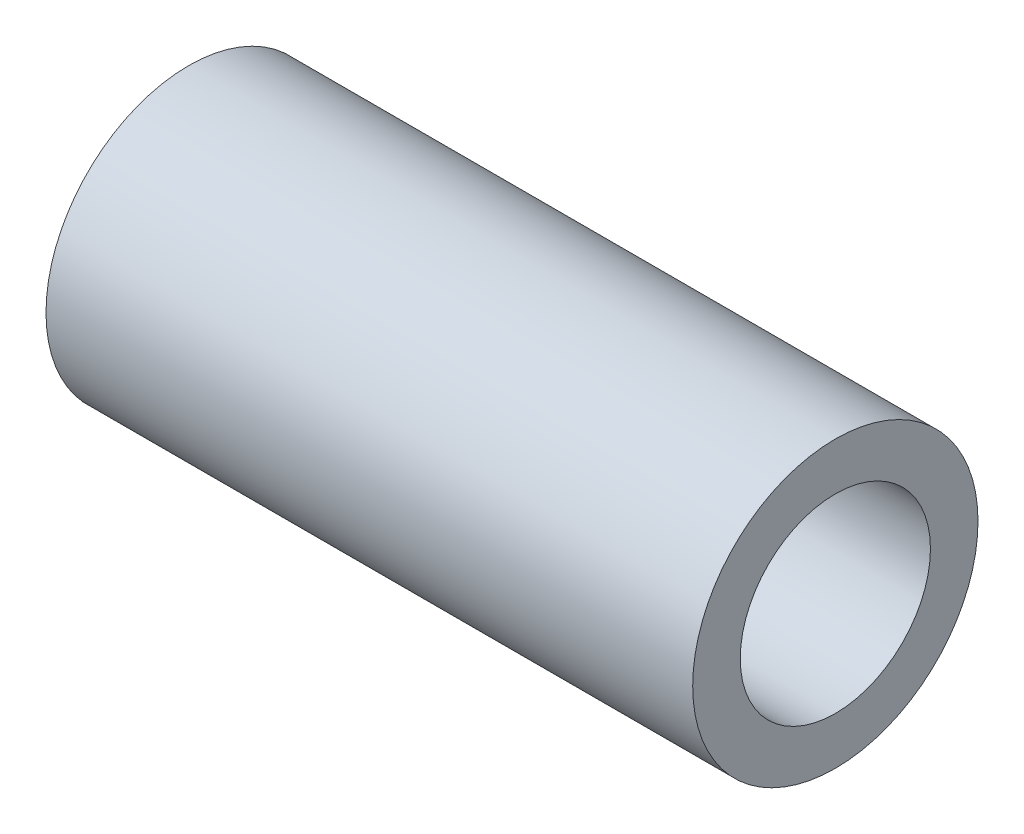
ISO-10303-21;
HEADER;
FILE_DESCRIPTION(('STEP AP214'),'2;1');
FILE_NAME('part.step','',(''),(''),'','','');
FILE_SCHEMA(('AUTOMOTIVE_DESIGN { 1 0 10303 214 1 1 1 1 }'));
ENDSEC;
DATA;
#1=APPLICATION_CONTEXT('core data for automotive mechanical design processes');
#2=APPLICATION_PROTOCOL_DEFINITION('international standard','automotive_design',2000,#1);
#3=PRODUCT_CONTEXT('',#1,'mechanical');
#4=PRODUCT('Part','Part','',(#3));
#5=PRODUCT_RELATED_PRODUCT_CATEGORY('part','',(#4));
#6=PRODUCT_DEFINITION_FORMATION('','',#4);
#7=PRODUCT_DEFINITION_CONTEXT('part definition',#1,'design');
#8=PRODUCT_DEFINITION('design','',#6,#7);
#9=PRODUCT_DEFINITION_SHAPE('','',#8);
#10=(LENGTH_UNIT() NAMED_UNIT(*) SI_UNIT(.MILLI.,.METRE.));
#11=(NAMED_UNIT(*) PLANE_ANGLE_UNIT() SI_UNIT($,.RADIAN.));
#12=(NAMED_UNIT(*) SI_UNIT($,.STERADIAN.) SOLID_ANGLE_UNIT());
#13=UNCERTAINTY_MEASURE_WITH_UNIT(LENGTH_MEASURE(1.E-05),#10,'distance_accuracy_value','');
#14=(GEOMETRIC_REPRESENTATION_CONTEXT(3) GLOBAL_UNCERTAINTY_ASSIGNED_CONTEXT((#13)) GLOBAL_UNIT_ASSIGNED_CONTEXT((#10,
#11,#12)) REPRESENTATION_CONTEXT('',''));
#15=CARTESIAN_POINT('',(0.,0.,0.));
#16=DIRECTION('',(0.,0.,1.));
#17=DIRECTION('',(1.,0.,0.));
#18=AXIS2_PLACEMENT_3D('',#15,#16,#17);
#19=CARTESIAN_POINT('',(0.,0.,0.));
#20=DIRECTION('',(1.,0.,0.));
#21=DIRECTION('',(0.,0.,-1.));
#22=AXIS2_PLACEMENT_3D('',#19,#20,#21);
#23=PLANE('',#22);
#24=CARTESIAN_POINT('',(0.,0.,0.));
#25=DIRECTION('',(-1.,0.,0.));
#26=DIRECTION('',(0.,0.,1.));
#27=AXIS2_PLACEMENT_3D('',#24,#25,#26);
#28=CIRCLE('',#27,4.5);
#29=CARTESIAN_POINT('',(0.,0.,4.5));
#30=VERTEX_POINT('',#29);
#31=EDGE_CURVE('E10',#30,#30,#28,.T.);
#32=ORIENTED_EDGE('',*,*,#31,.T.);
#33=EDGE_LOOP('',(#32));
#34=FACE_BOUND('',#33,.T.);
#35=CARTESIAN_POINT('',(0.,0.,0.));
#36=DIRECTION('',(-1.,0.,0.));
#37=DIRECTION('',(0.,0.,1.));
#38=AXIS2_PLACEMENT_3D('',#35,#36,#37);
#39=CIRCLE('',#38,3.);
#40=CARTESIAN_POINT('',(0.,0.,3.));
#41=VERTEX_POINT('',#40);
#42=EDGE_CURVE('E40',#41,#41,#39,.T.);
#43=ORIENTED_EDGE('',*,*,#42,.F.);
#44=EDGE_LOOP('',(#43));
#45=FACE_BOUND('',#44,.T.);
#46=ADVANCED_FACE('F30',(#34,#45),#23,.F.);
#47=CARTESIAN_POINT('',(20.4,0.,0.));
#48=DIRECTION('',(-1.,0.,0.));
#49=DIRECTION('',(0.,0.,1.));
#50=AXIS2_PLACEMENT_3D('',#47,#48,#49);
#51=PLANE('',#50);
#52=CARTESIAN_POINT('',(20.4,0.,0.));
#53=DIRECTION('',(-1.,0.,0.));
#54=DIRECTION('',(0.,0.,1.));
#55=AXIS2_PLACEMENT_3D('',#52,#53,#54);
#56=CIRCLE('',#55,4.5);
#57=CARTESIAN_POINT('',(20.4,0.,4.5));
#58=VERTEX_POINT('',#57);
#59=EDGE_CURVE('E36',#58,#58,#56,.T.);
#60=ORIENTED_EDGE('',*,*,#59,.F.);
#61=EDGE_LOOP('',(#60));
#62=FACE_BOUND('',#61,.T.);
#63=CARTESIAN_POINT('',(20.4,0.,0.));
#64=DIRECTION('',(-1.,0.,0.));
#65=DIRECTION('',(0.,0.,1.));
#66=AXIS2_PLACEMENT_3D('',#63,#64,#65);
#67=CIRCLE('',#66,3.);
#68=CARTESIAN_POINT('',(20.4,0.,3.));
#69=VERTEX_POINT('',#68);
#70=EDGE_CURVE('E44',#69,#69,#67,.T.);
#71=ORIENTED_EDGE('',*,*,#70,.T.);
#72=EDGE_LOOP('',(#71));
#73=FACE_BOUND('',#72,.T.);
#74=ADVANCED_FACE('F50',(#62,#73),#51,.F.);
#75=CARTESIAN_POINT('',(-6.50083437449572,0.,0.));
#76=DIRECTION('',(-1.,0.,0.));
#77=DIRECTION('',(0.,0.,1.));
#78=AXIS2_PLACEMENT_3D('',#75,#76,#77);
#79=CYLINDRICAL_SURFACE('',#78,4.5);
#80=ORIENTED_EDGE('',*,*,#31,.F.);
#81=EDGE_LOOP('',(#80));
#82=FACE_BOUND('',#81,.T.);
#83=ORIENTED_EDGE('',*,*,#59,.T.);
#84=EDGE_LOOP('',(#83));
#85=FACE_BOUND('',#84,.T.);
#86=ADVANCED_FACE('F54',(#82,#85),#79,.T.);
#87=CARTESIAN_POINT('',(-3.05392755931504,0.,0.));
#88=DIRECTION('',(-1.,0.,0.));
#89=DIRECTION('',(0.,0.,1.));
#90=AXIS2_PLACEMENT_3D('',#87,#88,#89);
#91=CYLINDRICAL_SURFACE('',#90,3.);
#92=ORIENTED_EDGE('',*,*,#42,.T.);
#93=EDGE_LOOP('',(#92));
#94=FACE_BOUND('',#93,.T.);
#95=ORIENTED_EDGE('',*,*,#70,.F.);
#96=EDGE_LOOP('',(#95));
#97=FACE_BOUND('',#96,.T.);
#98=ADVANCED_FACE('F52',(#94,#97),#91,.F.);
#99=CLOSED_SHELL('',(#46,#74,#86,#98));
#100=MANIFOLD_SOLID_BREP('B2',#99);
#101=ADVANCED_BREP_SHAPE_REPRESENTATION('',(#18,#100),#14);
#102=SHAPE_DEFINITION_REPRESENTATION(#9,#101);
ENDSEC;
END-ISO-10303-21;
